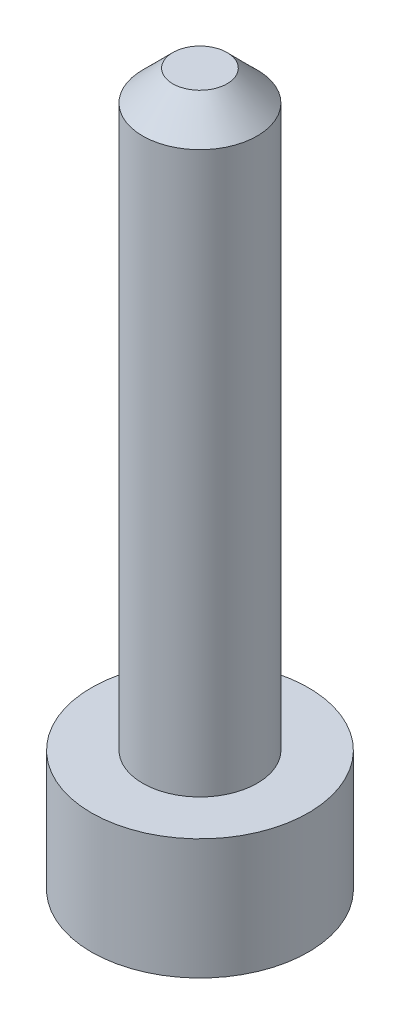
ISO-10303-21;
HEADER;
FILE_DESCRIPTION(('STEP AP214'),'2;1');
FILE_NAME('part.step','',(''),(''),'','','');
FILE_SCHEMA(('AUTOMOTIVE_DESIGN { 1 0 10303 214 1 1 1 1 }'));
ENDSEC;
DATA;
#1=APPLICATION_CONTEXT('core data for automotive mechanical design processes');
#2=APPLICATION_PROTOCOL_DEFINITION('international standard','automotive_design',2000,#1);
#3=PRODUCT_CONTEXT('',#1,'mechanical');
#4=PRODUCT('Part','Part','',(#3));
#5=PRODUCT_RELATED_PRODUCT_CATEGORY('part','',(#4));
#6=PRODUCT_DEFINITION_FORMATION('','',#4);
#7=PRODUCT_DEFINITION_CONTEXT('part definition',#1,'design');
#8=PRODUCT_DEFINITION('design','',#6,#7);
#9=PRODUCT_DEFINITION_SHAPE('','',#8);
#10=(LENGTH_UNIT() NAMED_UNIT(*) SI_UNIT(.MILLI.,.METRE.));
#11=(NAMED_UNIT(*) PLANE_ANGLE_UNIT() SI_UNIT($,.RADIAN.));
#12=(NAMED_UNIT(*) SI_UNIT($,.STERADIAN.) SOLID_ANGLE_UNIT());
#13=UNCERTAINTY_MEASURE_WITH_UNIT(LENGTH_MEASURE(1.E-05),#10,'distance_accuracy_value','');
#14=(GEOMETRIC_REPRESENTATION_CONTEXT(3) GLOBAL_UNCERTAINTY_ASSIGNED_CONTEXT((#13)) GLOBAL_UNIT_ASSIGNED_CONTEXT((#10,
#11,#12)) REPRESENTATION_CONTEXT('',''));
#15=CARTESIAN_POINT('',(0.,0.,0.));
#16=DIRECTION('',(0.,0.,1.));
#17=DIRECTION('',(1.,0.,0.));
#18=AXIS2_PLACEMENT_3D('',#15,#16,#17);
#19=CARTESIAN_POINT('',(0.,11.8,0.));
#20=DIRECTION('',(0.,-1.,0.));
#21=DIRECTION('',(0.,0.,-1.));
#22=AXIS2_PLACEMENT_3D('',#19,#20,#21);
#23=CYLINDRICAL_SURFACE('',#22,1.8);
#24=CARTESIAN_POINT('',(0.,0.,0.));
#25=DIRECTION('',(0.,1.,0.));
#26=DIRECTION('',(0.,0.,1.));
#27=AXIS2_PLACEMENT_3D('',#24,#25,#26);
#28=CIRCLE('',#27,1.8);
#29=CARTESIAN_POINT('',(0.,0.,1.8));
#30=VERTEX_POINT('',#29);
#31=EDGE_CURVE('E145',#30,#30,#28,.T.);
#32=ORIENTED_EDGE('',*,*,#31,.T.);
#33=EDGE_LOOP('',(#32));
#34=FACE_BOUND('',#33,.T.);
#35=CARTESIAN_POINT('',(0.,2.,0.));
#36=DIRECTION('',(0.,1.,0.));
#37=DIRECTION('',(0.,0.,1.));
#38=AXIS2_PLACEMENT_3D('',#35,#36,#37);
#39=CIRCLE('',#38,1.8);
#40=CARTESIAN_POINT('',(0.,2.,1.8));
#41=VERTEX_POINT('',#40);
#42=EDGE_CURVE('E144',#41,#41,#39,.T.);
#43=ORIENTED_EDGE('',*,*,#42,.F.);
#44=EDGE_LOOP('',(#43));
#45=FACE_BOUND('',#44,.T.);
#46=ADVANCED_FACE('F34',(#34,#45),#23,.T.);
#47=CARTESIAN_POINT('',(0.,0.,0.));
#48=DIRECTION('',(0.,1.,0.));
#49=DIRECTION('',(0.,0.,1.));
#50=AXIS2_PLACEMENT_3D('',#47,#48,#49);
#51=PLANE('',#50);
#52=DIRECTION('',(-0.5,0.,0.866025403784439));
#53=VECTOR('',#52,1.);
#54=CARTESIAN_POINT('',(1.15470053837925,0.,0.));
#55=LINE('',#54,#53);
#56=CARTESIAN_POINT('',(1.15470053837925,0.,0.));
#57=VERTEX_POINT('',#56);
#58=CARTESIAN_POINT('',(0.577350269189626,0.,1.));
#59=VERTEX_POINT('',#58);
#60=EDGE_CURVE('E123',#57,#59,#55,.T.);
#61=ORIENTED_EDGE('',*,*,#60,.F.);
#62=DIRECTION('',(0.499999999999999,0.,0.866025403784439));
#63=VECTOR('',#62,1.);
#64=CARTESIAN_POINT('',(0.577350269189626,0.,-1.));
#65=LINE('',#64,#63);
#66=CARTESIAN_POINT('',(0.577350269189626,0.,-1.));
#67=VERTEX_POINT('',#66);
#68=EDGE_CURVE('E49',#67,#57,#65,.T.);
#69=ORIENTED_EDGE('',*,*,#68,.F.);
#70=DIRECTION('',(1.,0.,0.));
#71=VECTOR('',#70,1.);
#72=CARTESIAN_POINT('',(-0.577350269189626,0.,-1.));
#73=LINE('',#72,#71);
#74=CARTESIAN_POINT('',(-0.577350269189626,0.,-1.));
#75=VERTEX_POINT('',#74);
#76=EDGE_CURVE('E132',#75,#67,#73,.T.);
#77=ORIENTED_EDGE('',*,*,#76,.F.);
#78=DIRECTION('',(0.5,0.,-0.866025403784439));
#79=VECTOR('',#78,1.);
#80=CARTESIAN_POINT('',(-1.15470053837925,0.,0.));
#81=LINE('',#80,#79);
#82=CARTESIAN_POINT('',(-1.15470053837925,0.,0.));
#83=VERTEX_POINT('',#82);
#84=EDGE_CURVE('E130',#83,#75,#81,.T.);
#85=ORIENTED_EDGE('',*,*,#84,.F.);
#86=DIRECTION('',(-0.5,0.,-0.866025403784439));
#87=VECTOR('',#86,1.);
#88=CARTESIAN_POINT('',(-0.577350269189626,0.,1.));
#89=LINE('',#88,#87);
#90=CARTESIAN_POINT('',(-0.577350269189626,0.,1.));
#91=VERTEX_POINT('',#90);
#92=EDGE_CURVE('E97',#91,#83,#89,.T.);
#93=ORIENTED_EDGE('',*,*,#92,.F.);
#94=DIRECTION('',(-1.,0.,0.));
#95=VECTOR('',#94,1.);
#96=CARTESIAN_POINT('',(0.577350269189626,0.,1.));
#97=LINE('',#96,#95);
#98=EDGE_CURVE('E126',#59,#91,#97,.T.);
#99=ORIENTED_EDGE('',*,*,#98,.F.);
#100=EDGE_LOOP('',(#61,#69,#77,#85,#93,#99));
#101=FACE_BOUND('',#100,.T.);
#102=ORIENTED_EDGE('',*,*,#31,.F.);
#103=EDGE_LOOP('',(#102));
#104=FACE_BOUND('',#103,.T.);
#105=ADVANCED_FACE('F167',(#101,#104),#51,.F.);
#106=CARTESIAN_POINT('',(0.,2.,0.));
#107=DIRECTION('',(0.,1.,0.));
#108=DIRECTION('',(0.,0.,1.));
#109=AXIS2_PLACEMENT_3D('',#106,#107,#108);
#110=PLANE('',#109);
#111=CARTESIAN_POINT('',(0.,2.,0.));
#112=DIRECTION('',(0.,1.,0.));
#113=DIRECTION('',(0.,0.,1.));
#114=AXIS2_PLACEMENT_3D('',#111,#112,#113);
#115=CIRCLE('',#114,0.95);
#116=CARTESIAN_POINT('',(0.,2.,0.95));
#117=VERTEX_POINT('',#116);
#118=EDGE_CURVE('E136',#117,#117,#115,.T.);
#119=ORIENTED_EDGE('',*,*,#118,.F.);
#120=EDGE_LOOP('',(#119));
#121=FACE_BOUND('',#120,.T.);
#122=ORIENTED_EDGE('',*,*,#42,.T.);
#123=EDGE_LOOP('',(#122));
#124=FACE_BOUND('',#123,.T.);
#125=ADVANCED_FACE('F172',(#121,#124),#110,.T.);
#126=CARTESIAN_POINT('',(0.,2.,0.));
#127=DIRECTION('',(0.,1.,0.));
#128=DIRECTION('',(0.,0.,1.));
#129=AXIS2_PLACEMENT_3D('',#126,#127,#128);
#130=CYLINDRICAL_SURFACE('',#129,0.95);
#131=CARTESIAN_POINT('',(0.,11.3,0.));
#132=DIRECTION('',(0.,1.,0.));
#133=DIRECTION('',(0.,0.,1.));
#134=AXIS2_PLACEMENT_3D('',#131,#132,#133);
#135=CIRCLE('',#134,0.95);
#136=CARTESIAN_POINT('',(0.,11.3,0.95));
#137=VERTEX_POINT('',#136);
#138=EDGE_CURVE('E12',#137,#137,#135,.F.);
#139=ORIENTED_EDGE('',*,*,#138,.T.);
#140=EDGE_LOOP('',(#139));
#141=FACE_BOUND('',#140,.T.);
#142=ORIENTED_EDGE('',*,*,#118,.T.);
#143=EDGE_LOOP('',(#142));
#144=FACE_BOUND('',#143,.T.);
#145=ADVANCED_FACE('F163',(#141,#144),#130,.T.);
#146=CARTESIAN_POINT('',(0.,11.8,0.));
#147=DIRECTION('',(0.,1.,0.));
#148=DIRECTION('',(0.,0.,1.));
#149=AXIS2_PLACEMENT_3D('',#146,#147,#148);
#150=PLANE('',#149);
#151=CARTESIAN_POINT('',(0.,11.8,0.));
#152=DIRECTION('',(0.,1.,0.));
#153=DIRECTION('',(0.,0.,1.));
#154=AXIS2_PLACEMENT_3D('',#151,#152,#153);
#155=CIRCLE('',#154,0.449999999999999);
#156=CARTESIAN_POINT('',(0.,11.8,0.449999999999999));
#157=VERTEX_POINT('',#156);
#158=EDGE_CURVE('E42',#157,#157,#155,.T.);
#159=ORIENTED_EDGE('',*,*,#158,.T.);
#160=EDGE_LOOP('',(#159));
#161=FACE_BOUND('',#160,.T.);
#162=ADVANCED_FACE('F152',(#161),#150,.T.);
#163=CARTESIAN_POINT('',(0.,11.8,0.));
#164=DIRECTION('',(0.,-1.,0.));
#165=DIRECTION('',(0.,0.,-1.));
#166=AXIS2_PLACEMENT_3D('',#163,#164,#165);
#167=CONICAL_SURFACE('',#166,0.449999999999999,0.785398163397447);
#168=ORIENTED_EDGE('',*,*,#138,.F.);
#169=EDGE_LOOP('',(#168));
#170=FACE_BOUND('',#169,.T.);
#171=ORIENTED_EDGE('',*,*,#158,.F.);
#172=EDGE_LOOP('',(#171));
#173=FACE_BOUND('',#172,.T.);
#174=ADVANCED_FACE('F36',(#170,#173),#167,.T.);
#175=CARTESIAN_POINT('',(0.577350269189626,1.5,-1.));
#176=DIRECTION('',(0.866025403784439,0.,-0.5));
#177=DIRECTION('',(-0.5,0.,-0.866025403784439));
#178=AXIS2_PLACEMENT_3D('',#175,#176,#177);
#179=PLANE('',#178);
#180=ORIENTED_EDGE('',*,*,#68,.T.);
#181=DIRECTION('',(0.,-1.,0.));
#182=VECTOR('',#181,1.);
#183=CARTESIAN_POINT('',(1.15470053837925,1.5,0.));
#184=LINE('',#183,#182);
#185=CARTESIAN_POINT('',(1.15470053837925,1.5,0.));
#186=VERTEX_POINT('',#185);
#187=EDGE_CURVE('E79',#186,#57,#184,.T.);
#188=ORIENTED_EDGE('',*,*,#187,.F.);
#189=DIRECTION('',(0.499999999999999,0.,0.866025403784439));
#190=VECTOR('',#189,1.);
#191=CARTESIAN_POINT('',(0.577350269189626,1.5,-1.));
#192=LINE('',#191,#190);
#193=CARTESIAN_POINT('',(0.577350269189626,1.5,-1.));
#194=VERTEX_POINT('',#193);
#195=EDGE_CURVE('E134',#194,#186,#192,.T.);
#196=ORIENTED_EDGE('',*,*,#195,.F.);
#197=DIRECTION('',(0.,-1.,0.));
#198=VECTOR('',#197,1.);
#199=CARTESIAN_POINT('',(0.577350269189626,1.5,-1.));
#200=LINE('',#199,#198);
#201=EDGE_CURVE('E57',#194,#67,#200,.T.);
#202=ORIENTED_EDGE('',*,*,#201,.T.);
#203=EDGE_LOOP('',(#180,#188,#196,#202));
#204=FACE_BOUND('',#203,.T.);
#205=ADVANCED_FACE('F155',(#204),#179,.F.);
#206=CARTESIAN_POINT('',(-0.577350269189626,1.5,-1.));
#207=DIRECTION('',(0.,0.,-1.));
#208=DIRECTION('',(-1.,0.,0.));
#209=AXIS2_PLACEMENT_3D('',#206,#207,#208);
#210=PLANE('',#209);
#211=ORIENTED_EDGE('',*,*,#76,.T.);
#212=ORIENTED_EDGE('',*,*,#201,.F.);
#213=DIRECTION('',(1.,0.,0.));
#214=VECTOR('',#213,1.);
#215=CARTESIAN_POINT('',(-0.577350269189626,1.5,-1.));
#216=LINE('',#215,#214);
#217=CARTESIAN_POINT('',(-0.577350269189626,1.5,-1.));
#218=VERTEX_POINT('',#217);
#219=EDGE_CURVE('E109',#218,#194,#216,.T.);
#220=ORIENTED_EDGE('',*,*,#219,.F.);
#221=DIRECTION('',(0.,-1.,0.));
#222=VECTOR('',#221,1.);
#223=CARTESIAN_POINT('',(-0.577350269189626,1.5,-1.));
#224=LINE('',#223,#222);
#225=EDGE_CURVE('E101',#218,#75,#224,.T.);
#226=ORIENTED_EDGE('',*,*,#225,.T.);
#227=EDGE_LOOP('',(#211,#212,#220,#226));
#228=FACE_BOUND('',#227,.T.);
#229=ADVANCED_FACE('F161',(#228),#210,.F.);
#230=CARTESIAN_POINT('',(-1.15470053837925,1.5,0.));
#231=DIRECTION('',(-0.866025403784438,0.,-0.5));
#232=DIRECTION('',(-0.5,0.,0.866025403784439));
#233=AXIS2_PLACEMENT_3D('',#230,#231,#232);
#234=PLANE('',#233);
#235=ORIENTED_EDGE('',*,*,#84,.T.);
#236=ORIENTED_EDGE('',*,*,#225,.F.);
#237=DIRECTION('',(0.5,0.,-0.866025403784439));
#238=VECTOR('',#237,1.);
#239=CARTESIAN_POINT('',(-1.15470053837925,1.5,0.));
#240=LINE('',#239,#238);
#241=CARTESIAN_POINT('',(-1.15470053837925,1.5,0.));
#242=VERTEX_POINT('',#241);
#243=EDGE_CURVE('E105',#242,#218,#240,.T.);
#244=ORIENTED_EDGE('',*,*,#243,.F.);
#245=DIRECTION('',(0.,-1.,0.));
#246=VECTOR('',#245,1.);
#247=CARTESIAN_POINT('',(-1.15470053837925,1.5,0.));
#248=LINE('',#247,#246);
#249=EDGE_CURVE('E90',#242,#83,#248,.T.);
#250=ORIENTED_EDGE('',*,*,#249,.T.);
#251=EDGE_LOOP('',(#235,#236,#244,#250));
#252=FACE_BOUND('',#251,.T.);
#253=ADVANCED_FACE('F106',(#252),#234,.F.);
#254=CARTESIAN_POINT('',(-0.577350269189626,1.5,1.));
#255=DIRECTION('',(-0.866025403784439,0.,0.5));
#256=DIRECTION('',(0.5,0.,0.866025403784439));
#257=AXIS2_PLACEMENT_3D('',#254,#255,#256);
#258=PLANE('',#257);
#259=ORIENTED_EDGE('',*,*,#92,.T.);
#260=ORIENTED_EDGE('',*,*,#249,.F.);
#261=DIRECTION('',(-0.5,0.,-0.866025403784439));
#262=VECTOR('',#261,1.);
#263=CARTESIAN_POINT('',(-0.577350269189626,1.5,1.));
#264=LINE('',#263,#262);
#265=CARTESIAN_POINT('',(-0.577350269189626,1.5,1.));
#266=VERTEX_POINT('',#265);
#267=EDGE_CURVE('E94',#266,#242,#264,.T.);
#268=ORIENTED_EDGE('',*,*,#267,.F.);
#269=DIRECTION('',(0.,-1.,0.));
#270=VECTOR('',#269,1.);
#271=CARTESIAN_POINT('',(-0.577350269189626,1.5,1.));
#272=LINE('',#271,#270);
#273=EDGE_CURVE('E102',#266,#91,#272,.T.);
#274=ORIENTED_EDGE('',*,*,#273,.T.);
#275=EDGE_LOOP('',(#259,#260,#268,#274));
#276=FACE_BOUND('',#275,.T.);
#277=ADVANCED_FACE('F92',(#276),#258,.F.);
#278=CARTESIAN_POINT('',(0.577350269189626,1.5,1.));
#279=DIRECTION('',(0.,0.,1.));
#280=DIRECTION('',(1.,0.,0.));
#281=AXIS2_PLACEMENT_3D('',#278,#279,#280);
#282=PLANE('',#281);
#283=ORIENTED_EDGE('',*,*,#98,.T.);
#284=ORIENTED_EDGE('',*,*,#273,.F.);
#285=DIRECTION('',(-1.,0.,0.));
#286=VECTOR('',#285,1.);
#287=CARTESIAN_POINT('',(0.577350269189626,1.5,1.));
#288=LINE('',#287,#286);
#289=CARTESIAN_POINT('',(0.577350269189626,1.5,1.));
#290=VERTEX_POINT('',#289);
#291=EDGE_CURVE('E115',#290,#266,#288,.T.);
#292=ORIENTED_EDGE('',*,*,#291,.F.);
#293=DIRECTION('',(0.,-1.,0.));
#294=VECTOR('',#293,1.);
#295=CARTESIAN_POINT('',(0.577350269189626,1.5,1.));
#296=LINE('',#295,#294);
#297=EDGE_CURVE('E139',#290,#59,#296,.T.);
#298=ORIENTED_EDGE('',*,*,#297,.T.);
#299=EDGE_LOOP('',(#283,#284,#292,#298));
#300=FACE_BOUND('',#299,.T.);
#301=ADVANCED_FACE('F186',(#300),#282,.F.);
#302=CARTESIAN_POINT('',(1.15470053837925,1.5,0.));
#303=DIRECTION('',(0.866025403784438,0.,0.5));
#304=DIRECTION('',(0.5,0.,-0.866025403784439));
#305=AXIS2_PLACEMENT_3D('',#302,#303,#304);
#306=PLANE('',#305);
#307=ORIENTED_EDGE('',*,*,#60,.T.);
#308=ORIENTED_EDGE('',*,*,#297,.F.);
#309=DIRECTION('',(-0.5,0.,0.866025403784439));
#310=VECTOR('',#309,1.);
#311=CARTESIAN_POINT('',(1.15470053837925,1.5,0.));
#312=LINE('',#311,#310);
#313=EDGE_CURVE('E117',#186,#290,#312,.T.);
#314=ORIENTED_EDGE('',*,*,#313,.F.);
#315=ORIENTED_EDGE('',*,*,#187,.T.);
#316=EDGE_LOOP('',(#307,#308,#314,#315));
#317=FACE_BOUND('',#316,.T.);
#318=ADVANCED_FACE('F183',(#317),#306,.F.);
#319=CARTESIAN_POINT('',(0.,1.5,0.));
#320=DIRECTION('',(0.,-1.,0.));
#321=DIRECTION('',(0.,0.,-1.));
#322=AXIS2_PLACEMENT_3D('',#319,#320,#321);
#323=PLANE('',#322);
#324=ORIENTED_EDGE('',*,*,#195,.T.);
#325=ORIENTED_EDGE('',*,*,#313,.T.);
#326=ORIENTED_EDGE('',*,*,#291,.T.);
#327=ORIENTED_EDGE('',*,*,#267,.T.);
#328=ORIENTED_EDGE('',*,*,#243,.T.);
#329=ORIENTED_EDGE('',*,*,#219,.T.);
#330=EDGE_LOOP('',(#324,#325,#326,#327,#328,#329));
#331=FACE_BOUND('',#330,.T.);
#332=ADVANCED_FACE('F112',(#331),#323,.T.);
#333=CLOSED_SHELL('',(#46,#105,#125,#145,#162,#174,#205,#229,#253,#277,#301,#318,#332));
#334=MANIFOLD_SOLID_BREP('B2',#333);
#335=ADVANCED_BREP_SHAPE_REPRESENTATION('',(#18,#334),#14);
#336=SHAPE_DEFINITION_REPRESENTATION(#9,#335);
ENDSEC;
END-ISO-10303-21;
